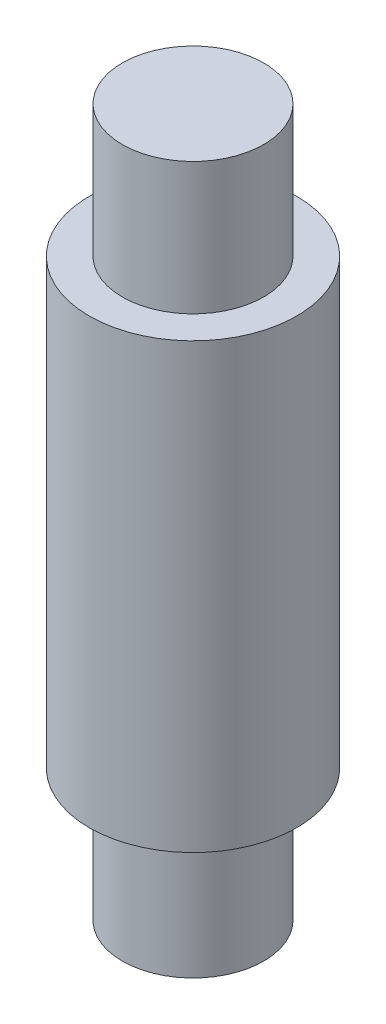
ISO-10303-21;
HEADER;
FILE_DESCRIPTION(('STEP AP214'),'2;1');
FILE_NAME('part.step','',(''),(''),'','','');
FILE_SCHEMA(('AUTOMOTIVE_DESIGN { 1 0 10303 214 1 1 1 1 }'));
ENDSEC;
DATA;
#1=APPLICATION_CONTEXT('core data for automotive mechanical design processes');
#2=APPLICATION_PROTOCOL_DEFINITION('international standard','automotive_design',2000,#1);
#3=PRODUCT_CONTEXT('',#1,'mechanical');
#4=PRODUCT('Part','Part','',(#3));
#5=PRODUCT_RELATED_PRODUCT_CATEGORY('part','',(#4));
#6=PRODUCT_DEFINITION_FORMATION('','',#4);
#7=PRODUCT_DEFINITION_CONTEXT('part definition',#1,'design');
#8=PRODUCT_DEFINITION('design','',#6,#7);
#9=PRODUCT_DEFINITION_SHAPE('','',#8);
#10=(LENGTH_UNIT() NAMED_UNIT(*) SI_UNIT(.MILLI.,.METRE.));
#11=(NAMED_UNIT(*) PLANE_ANGLE_UNIT() SI_UNIT($,.RADIAN.));
#12=(NAMED_UNIT(*) SI_UNIT($,.STERADIAN.) SOLID_ANGLE_UNIT());
#13=UNCERTAINTY_MEASURE_WITH_UNIT(LENGTH_MEASURE(1.E-05),#10,'distance_accuracy_value','');
#14=(GEOMETRIC_REPRESENTATION_CONTEXT(3) GLOBAL_UNCERTAINTY_ASSIGNED_CONTEXT((#13)) GLOBAL_UNIT_ASSIGNED_CONTEXT((#10,
#11,#12)) REPRESENTATION_CONTEXT('',''));
#15=CARTESIAN_POINT('',(0.,0.,0.));
#16=DIRECTION('',(0.,0.,1.));
#17=DIRECTION('',(1.,0.,0.));
#18=AXIS2_PLACEMENT_3D('',#15,#16,#17);
#19=CARTESIAN_POINT('',(0.,0.,0.));
#20=DIRECTION('',(0.,1.,0.));
#21=DIRECTION('',(0.,0.,1.));
#22=AXIS2_PLACEMENT_3D('',#19,#20,#21);
#23=PLANE('',#22);
#24=CARTESIAN_POINT('',(0.,0.,0.));
#25=DIRECTION('',(0.,1.,0.));
#26=DIRECTION('',(0.,0.,1.));
#27=AXIS2_PLACEMENT_3D('',#24,#25,#26);
#28=CIRCLE('',#27,15.);
#29=CARTESIAN_POINT('',(0.,0.,15.));
#30=VERTEX_POINT('',#29);
#31=EDGE_CURVE('E10',#30,#30,#28,.T.);
#32=ORIENTED_EDGE('',*,*,#31,.F.);
#33=EDGE_LOOP('',(#32));
#34=FACE_BOUND('',#33,.T.);
#35=ADVANCED_FACE('F43',(#34),#23,.F.);
#36=CARTESIAN_POINT('',(0.,150.,0.));
#37=DIRECTION('',(0.,1.,0.));
#38=DIRECTION('',(0.,0.,1.));
#39=AXIS2_PLACEMENT_3D('',#36,#37,#38);
#40=CYLINDRICAL_SURFACE('',#39,15.);
#41=CARTESIAN_POINT('',(0.,28.,0.));
#42=DIRECTION('',(0.,1.,0.));
#43=DIRECTION('',(0.,0.,1.));
#44=AXIS2_PLACEMENT_3D('',#41,#42,#43);
#45=CIRCLE('',#44,15.);
#46=CARTESIAN_POINT('',(0.,28.,15.));
#47=VERTEX_POINT('',#46);
#48=EDGE_CURVE('E50',#47,#47,#45,.T.);
#49=ORIENTED_EDGE('',*,*,#48,.F.);
#50=EDGE_LOOP('',(#49));
#51=FACE_BOUND('',#50,.T.);
#52=ORIENTED_EDGE('',*,*,#31,.T.);
#53=EDGE_LOOP('',(#52));
#54=FACE_BOUND('',#53,.T.);
#55=ADVANCED_FACE('F97',(#51,#54),#40,.T.);
#56=CARTESIAN_POINT('',(15.,28.,0.));
#57=DIRECTION('',(0.,1.,0.));
#58=DIRECTION('',(0.,0.,1.));
#59=AXIS2_PLACEMENT_3D('',#56,#57,#58);
#60=PLANE('',#59);
#61=CARTESIAN_POINT('',(0.,28.,0.));
#62=DIRECTION('',(0.,1.,0.));
#63=DIRECTION('',(0.,0.,1.));
#64=AXIS2_PLACEMENT_3D('',#61,#62,#63);
#65=CIRCLE('',#64,22.);
#66=CARTESIAN_POINT('',(0.,28.,22.));
#67=VERTEX_POINT('',#66);
#68=EDGE_CURVE('E55',#67,#67,#65,.T.);
#69=ORIENTED_EDGE('',*,*,#68,.F.);
#70=EDGE_LOOP('',(#69));
#71=FACE_BOUND('',#70,.T.);
#72=ORIENTED_EDGE('',*,*,#48,.T.);
#73=EDGE_LOOP('',(#72));
#74=FACE_BOUND('',#73,.T.);
#75=ADVANCED_FACE('F92',(#71,#74),#60,.F.);
#76=CARTESIAN_POINT('',(0.,150.,0.));
#77=DIRECTION('',(0.,1.,0.));
#78=DIRECTION('',(0.,0.,1.));
#79=AXIS2_PLACEMENT_3D('',#76,#77,#78);
#80=CYLINDRICAL_SURFACE('',#79,22.);
#81=CARTESIAN_POINT('',(0.,122.,0.));
#82=DIRECTION('',(0.,1.,0.));
#83=DIRECTION('',(0.,0.,1.));
#84=AXIS2_PLACEMENT_3D('',#81,#82,#83);
#85=CIRCLE('',#84,22.);
#86=CARTESIAN_POINT('',(0.,122.,22.));
#87=VERTEX_POINT('',#86);
#88=EDGE_CURVE('E60',#87,#87,#85,.T.);
#89=ORIENTED_EDGE('',*,*,#88,.F.);
#90=EDGE_LOOP('',(#89));
#91=FACE_BOUND('',#90,.T.);
#92=ORIENTED_EDGE('',*,*,#68,.T.);
#93=EDGE_LOOP('',(#92));
#94=FACE_BOUND('',#93,.T.);
#95=ADVANCED_FACE('F86',(#91,#94),#80,.T.);
#96=CARTESIAN_POINT('',(15.,122.,0.));
#97=DIRECTION('',(0.,-1.,0.));
#98=DIRECTION('',(0.,0.,-1.));
#99=AXIS2_PLACEMENT_3D('',#96,#97,#98);
#100=PLANE('',#99);
#101=CARTESIAN_POINT('',(0.,122.,0.));
#102=DIRECTION('',(0.,1.,0.));
#103=DIRECTION('',(0.,0.,1.));
#104=AXIS2_PLACEMENT_3D('',#101,#102,#103);
#105=CIRCLE('',#104,15.);
#106=CARTESIAN_POINT('',(0.,122.,15.));
#107=VERTEX_POINT('',#106);
#108=EDGE_CURVE('E66',#107,#107,#105,.T.);
#109=ORIENTED_EDGE('',*,*,#108,.F.);
#110=EDGE_LOOP('',(#109));
#111=FACE_BOUND('',#110,.T.);
#112=ORIENTED_EDGE('',*,*,#88,.T.);
#113=EDGE_LOOP('',(#112));
#114=FACE_BOUND('',#113,.T.);
#115=ADVANCED_FACE('F80',(#111,#114),#100,.F.);
#116=CARTESIAN_POINT('',(0.,150.,0.));
#117=DIRECTION('',(0.,1.,0.));
#118=DIRECTION('',(0.,0.,1.));
#119=AXIS2_PLACEMENT_3D('',#116,#117,#118);
#120=CYLINDRICAL_SURFACE('',#119,15.);
#121=CARTESIAN_POINT('',(0.,150.,0.));
#122=DIRECTION('',(0.,1.,0.));
#123=DIRECTION('',(0.,0.,1.));
#124=AXIS2_PLACEMENT_3D('',#121,#122,#123);
#125=CIRCLE('',#124,15.);
#126=CARTESIAN_POINT('',(0.,150.,15.));
#127=VERTEX_POINT('',#126);
#128=EDGE_CURVE('E70',#127,#127,#125,.T.);
#129=ORIENTED_EDGE('',*,*,#128,.F.);
#130=EDGE_LOOP('',(#129));
#131=FACE_BOUND('',#130,.T.);
#132=ORIENTED_EDGE('',*,*,#108,.T.);
#133=EDGE_LOOP('',(#132));
#134=FACE_BOUND('',#133,.T.);
#135=ADVANCED_FACE('F77',(#131,#134),#120,.T.);
#136=CARTESIAN_POINT('',(15.,150.,0.));
#137=DIRECTION('',(0.,-1.,0.));
#138=DIRECTION('',(0.,0.,-1.));
#139=AXIS2_PLACEMENT_3D('',#136,#137,#138);
#140=PLANE('',#139);
#141=ORIENTED_EDGE('',*,*,#128,.T.);
#142=EDGE_LOOP('',(#141));
#143=FACE_BOUND('',#142,.T.);
#144=ADVANCED_FACE('F75',(#143),#140,.F.);
#145=CLOSED_SHELL('',(#35,#55,#75,#95,#115,#135,#144));
#146=MANIFOLD_SOLID_BREP('B2',#145);
#147=ADVANCED_BREP_SHAPE_REPRESENTATION('',(#18,#146),#14);
#148=SHAPE_DEFINITION_REPRESENTATION(#9,#147);
ENDSEC;
END-ISO-10303-21;
